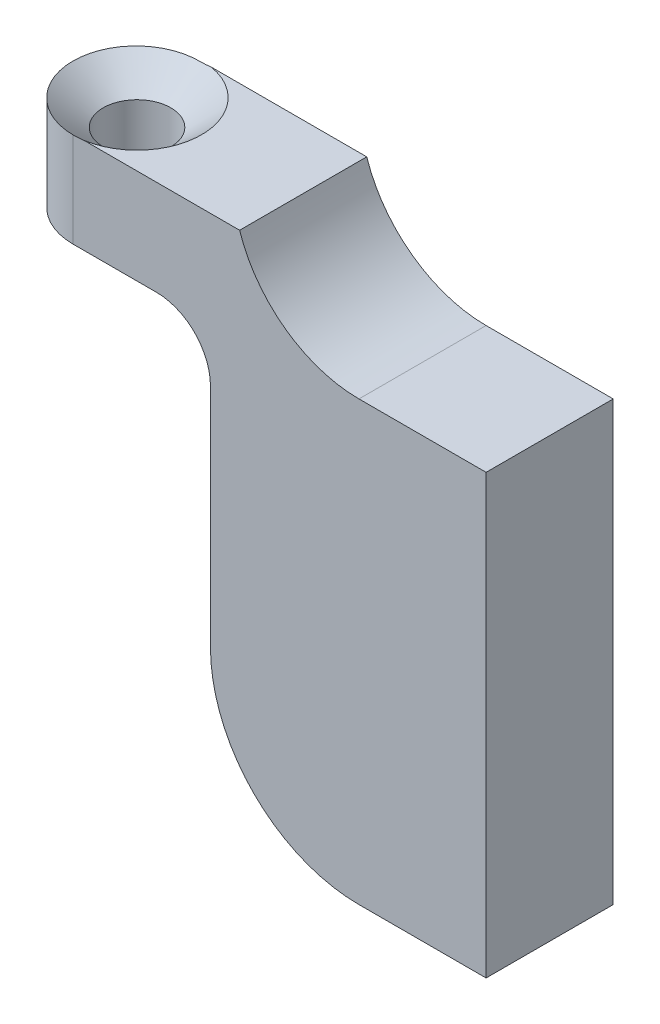
ISO-10303-21;
HEADER;
FILE_DESCRIPTION(('STEP AP214'),'2;1');
FILE_NAME('part.step','',(''),(''),'','','');
FILE_SCHEMA(('AUTOMOTIVE_DESIGN { 1 0 10303 214 1 1 1 1 }'));
ENDSEC;
DATA;
#1=APPLICATION_CONTEXT('core data for automotive mechanical design processes');
#2=APPLICATION_PROTOCOL_DEFINITION('international standard','automotive_design',2000,#1);
#3=PRODUCT_CONTEXT('',#1,'mechanical');
#4=PRODUCT('Part','Part','',(#3));
#5=PRODUCT_RELATED_PRODUCT_CATEGORY('part','',(#4));
#6=PRODUCT_DEFINITION_FORMATION('','',#4);
#7=PRODUCT_DEFINITION_CONTEXT('part definition',#1,'design');
#8=PRODUCT_DEFINITION('design','',#6,#7);
#9=PRODUCT_DEFINITION_SHAPE('','',#8);
#10=(LENGTH_UNIT() NAMED_UNIT(*) SI_UNIT(.MILLI.,.METRE.));
#11=(NAMED_UNIT(*) PLANE_ANGLE_UNIT() SI_UNIT($,.RADIAN.));
#12=(NAMED_UNIT(*) SI_UNIT($,.STERADIAN.) SOLID_ANGLE_UNIT());
#13=UNCERTAINTY_MEASURE_WITH_UNIT(LENGTH_MEASURE(1.E-05),#10,'distance_accuracy_value','');
#14=(GEOMETRIC_REPRESENTATION_CONTEXT(3) GLOBAL_UNCERTAINTY_ASSIGNED_CONTEXT((#13)) GLOBAL_UNIT_ASSIGNED_CONTEXT((#10,
#11,#12)) REPRESENTATION_CONTEXT('',''));
#15=CARTESIAN_POINT('',(0.,0.,0.));
#16=DIRECTION('',(0.,0.,1.));
#17=DIRECTION('',(1.,0.,0.));
#18=AXIS2_PLACEMENT_3D('',#15,#16,#17);
#19=CARTESIAN_POINT('',(-41.2749999999992,52.3130745451054,6.35));
#20=DIRECTION('',(0.,-1.,0.));
#21=DIRECTION('',(0.,0.,-1.));
#22=AXIS2_PLACEMENT_3D('',#19,#20,#21);
#23=CYLINDRICAL_SURFACE('',#22,6.35000000000026);
#24=DIRECTION('',(0.,-1.,0.));
#25=VECTOR('',#24,1.);
#26=CARTESIAN_POINT('',(-41.2749999999992,14.8404462835557,12.7));
#27=LINE('',#26,#25);
#28=CARTESIAN_POINT('',(-41.2749999999992,52.3130745451054,12.7));
#29=VERTEX_POINT('',#28);
#30=CARTESIAN_POINT('',(-41.275,42.8625,12.7));
#31=VERTEX_POINT('',#30);
#32=EDGE_CURVE('E211',#29,#31,#27,.T.);
#33=ORIENTED_EDGE('',*,*,#32,.F.);
#34=CARTESIAN_POINT('',(-41.2749999999992,52.3130745451054,0.));
#35=CARTESIAN_POINT('',(-41.4268698471331,52.3140939860725,-9.87468005514379E-06));
#36=CARTESIAN_POINT('',(-41.5787378013911,52.3151131175937,0.00544794530793456));
#37=CARTESIAN_POINT('',(-41.8816722784691,52.3171454239296,0.0272258373707776));
#38=CARTESIAN_POINT('',(-42.0327389077657,52.3181585995378,0.0435444279210268));
#39=CARTESIAN_POINT('',(-42.333390441845,52.320174443385,0.0869816690406525));
#40=CARTESIAN_POINT('',(-42.4829745640871,52.3211771060894,0.114105741388505));
#41=CARTESIAN_POINT('',(-42.7798244785303,52.3231663393665,0.179012242776178));
#42=CARTESIAN_POINT('',(-42.9270900087559,52.3241529081211,0.216795867232175));
#43=CARTESIAN_POINT('',(-43.2439947460277,52.326275355595,0.310347162208052));
#44=CARTESIAN_POINT('',(-43.413050975537,52.3274072280723,0.368103008695369));
#45=CARTESIAN_POINT('',(-43.7457620832815,52.3296341235968,0.497673645509659));
#46=CARTESIAN_POINT('',(-43.9094146417638,52.3307291308219,0.569494384393223));
#47=CARTESIAN_POINT('',(-44.2300621172719,52.3328739652706,0.726657600063899));
#48=CARTESIAN_POINT('',(-44.3870581156791,52.3339237998333,0.811997869804555));
#49=CARTESIAN_POINT('',(-44.6933057854976,52.3359711085018,0.995603527580531));
#50=CARTESIAN_POINT('',(-44.8425572739418,52.3369685813706,1.09386922079029));
#51=CARTESIAN_POINT('',(-45.1322293906621,52.3389039989278,1.30260987682396));
#52=CARTESIAN_POINT('',(-45.2726513503513,52.3398419525913,1.41308299191824));
#53=CARTESIAN_POINT('',(-45.5436911965323,52.3416519300888,1.6454658259427));
#54=CARTESIAN_POINT('',(-45.6743090412555,52.342523953642,1.76737559359139));
#55=CARTESIAN_POINT('',(-45.9248364787141,52.3441961355044,2.02179025019129));
#56=CARTESIAN_POINT('',(-46.0447439339612,52.3449962794686,2.15429724409001));
#57=CARTESIAN_POINT('',(-46.2729661951852,52.3465189009263,2.42893992624973));
#58=CARTESIAN_POINT('',(-46.3812812390111,52.3472413800132,2.57107541685887));
#59=CARTESIAN_POINT('',(-46.5855889348812,52.3486039014058,2.86402157045111));
#60=CARTESIAN_POINT('',(-46.68157703735,52.3492439132749,3.01483540683342));
#61=CARTESIAN_POINT('',(-46.8604686157668,52.3504365089439,3.32395933303365));
#62=CARTESIAN_POINT('',(-46.9433767584896,52.3509891239261,3.48226672291311));
#63=CARTESIAN_POINT('',(-47.0955353733745,52.3520031891373,3.80525713057763));
#64=CARTESIAN_POINT('',(-47.1647904930456,52.3524646703884,3.96993795592079));
#65=CARTESIAN_POINT('',(-47.2891729277185,52.3532934067367,4.30449373365843));
#66=CARTESIAN_POINT('',(-47.3443022274757,52.3536606750713,4.47436795259418));
#67=CARTESIAN_POINT('',(-47.4692968494963,52.3544933207101,4.92321976370062));
#68=CARTESIAN_POINT('',(-47.5276189126782,52.3548817598685,5.20550541387347));
#69=CARTESIAN_POINT('',(-47.6054643347005,52.355400210459,5.77518776350102));
#70=CARTESIAN_POINT('',(-47.6250018979635,52.3555303165028,6.06258255286371));
#71=CARTESIAN_POINT('',(-47.6249979781623,52.355530290788,6.65617612249392));
#72=CARTESIAN_POINT('',(-47.602822726082,52.3553826200574,6.96237795685506));
#73=CARTESIAN_POINT('',(-47.5144935535054,52.3547943416938,7.56862217616997));
#74=CARTESIAN_POINT('',(-47.4483160573978,52.3543535770262,7.86866117029854));
#75=CARTESIAN_POINT('',(-47.3099857952323,52.3534320608107,8.33327759555382));
#76=CARTESIAN_POINT('',(-47.2518390226122,52.3530446730122,8.50215631795867));
#77=CARTESIAN_POINT('',(-47.1215154805207,52.3521763087863,8.83446834735592));
#78=CARTESIAN_POINT('',(-47.0493372238806,52.3516953224386,8.99790107498561));
#79=CARTESIAN_POINT('',(-46.8914618054659,52.3506430933179,9.31812042399158));
#80=CARTESIAN_POINT('',(-46.8057626554945,52.3500718372712,9.47490606362998));
#81=CARTESIAN_POINT('',(-46.6214279124006,52.3488428665938,9.78075754511855));
#82=CARTESIAN_POINT('',(-46.5227877098191,52.3481851211564,9.92982060975895));
#83=CARTESIAN_POINT('',(-46.3133473067956,52.3467882563522,10.2190334246649));
#84=CARTESIAN_POINT('',(-46.2025529785512,52.3460491762812,10.3591874280458));
#85=CARTESIAN_POINT('',(-45.9695099205334,52.3444942512222,10.6297151271848));
#86=CARTESIAN_POINT('',(-45.8472569735738,52.343678377971,10.7600851900609));
#87=CARTESIAN_POINT('',(-45.5922631790315,52.3419762154945,11.0099992342401));
#88=CARTESIAN_POINT('',(-45.4595274723169,52.3410899607839,11.1295484612281));
#89=CARTESIAN_POINT('',(-45.1844095219935,52.3392525526835,11.3570844600893));
#90=CARTESIAN_POINT('',(-45.042023782562,52.3383013757741,11.4650670048636));
#91=CARTESIAN_POINT('',(-44.7486633474776,52.3363410897877,11.6686499687244));
#92=CARTESIAN_POINT('',(-44.5976888220746,52.3353319818591,11.7642506331257));
#93=CARTESIAN_POINT('',(-44.2882235271498,52.3332629116123,11.9423934831827));
#94=CARTESIAN_POINT('',(-44.1297326573017,52.3322029486152,12.0249354944707));
#95=CARTESIAN_POINT('',(-43.8063736180313,52.330039700871,12.1763626581602));
#96=CARTESIAN_POINT('',(-43.6415064168998,52.3289364227011,12.2452498744822));
#97=CARTESIAN_POINT('',(-43.3066083870603,52.3266945945607,12.3688840078618));
#98=CARTESIAN_POINT('',(-43.1365778845151,52.3255560468181,12.4236318160301));
#99=CARTESIAN_POINT('',(-42.6896669290981,52.3225624826503,12.5469611402987));
#100=CARTESIAN_POINT('',(-42.4095599532592,52.3206852723371,12.6043088722377));
#101=CARTESIAN_POINT('',(-41.9859149548997,52.3178445697991,12.661693093264));
#102=CARTESIAN_POINT('',(-41.8441436022331,52.3168936849093,12.6760482629347));
#103=CARTESIAN_POINT('',(-41.559933547615,52.3149869271481,12.6952007762607));
#104=CARTESIAN_POINT('',(-41.4174947412127,52.3140310534932,12.6999965702352));
#105=CARTESIAN_POINT('',(-41.2749999999993,52.3130745451056,12.7000000000003));
#106=B_SPLINE_CURVE_WITH_KNOTS('',3,(#34,#35,#36,#37,#38,#39,#40,#41,#42,#43,#44,#45,#46,#47,
#48,#49,#50,#51,#52,#53,#54,#55,#56,#57,#58,#59,#60,#61,#62,#63,#64,#65,#66,#67,#68,#69,#70,#71,
#72,#73,#74,#75,#76,#77,#78,#79,#80,#81,#82,#83,#84,#85,#86,#87,#88,#89,#90,#91,#92,#93,#94,#95,
#96,#97,#98,#99,#100,#101,#102,#103,#104,#105),.UNSPECIFIED.,.F.,.F.,(4,2,2,2,2,2,2,2,2,2,2,2,2,
2,2,2,2,2,2,2,2,2,2,2,2,2,2,2,2,2,2,2,2,2,2,4),(0.,0.455518696194547,0.910975267526965,
1.366660658012,1.82239717169296,2.35770541021033,2.8932405409974,3.42868833626617,
3.96414877594255,4.4995282784321,5.03491006166508,5.57039845420717,6.10587585767956,
6.64155032835359,7.17703324236563,7.71233356127577,8.24755862625456,9.10946066206404,
9.97104697687182,10.8888658486524,11.8071768679571,12.3424506069777,12.8777811095416,
13.4131904039441,13.9487909255887,14.4841338051537,15.0196744897535,15.5549541506595,
16.0904287693983,16.6258927774694,17.1613639347998,17.6967540939153,18.2321105027953,
19.0868657597344,19.5140981214998,19.9413997367462),.UNSPECIFIED.);
#107=CARTESIAN_POINT('',(-41.2749999999992,52.3130745451054,0.));
#108=VERTEX_POINT('',#107);
#109=EDGE_CURVE('E52',#108,#29,#106,.T.);
#110=ORIENTED_EDGE('',*,*,#109,.F.);
#111=DIRECTION('',(0.,1.,0.));
#112=VECTOR('',#111,1.);
#113=CARTESIAN_POINT('',(-41.2749999999992,52.3130745451054,0.));
#114=LINE('',#113,#112);
#115=CARTESIAN_POINT('',(-41.275,42.8625,0.));
#116=VERTEX_POINT('',#115);
#117=EDGE_CURVE('E260',#116,#108,#114,.T.);
#118=ORIENTED_EDGE('',*,*,#117,.F.);
#119=CARTESIAN_POINT('',(-41.2749999999992,42.8625,6.35));
#120=DIRECTION('',(0.,1.,0.));
#121=DIRECTION('',(0.,0.,1.));
#122=AXIS2_PLACEMENT_3D('',#119,#120,#121);
#123=CIRCLE('',#122,6.35000000000026);
#124=EDGE_CURVE('E11',#31,#116,#123,.F.);
#125=ORIENTED_EDGE('',*,*,#124,.F.);
#126=EDGE_LOOP('',(#33,#110,#118,#125));
#127=FACE_BOUND('',#126,.T.);
#128=ADVANCED_FACE('F43',(#127),#23,.T.);
#129=CARTESIAN_POINT('',(-24.6251819079608,52.3875,12.7));
#130=DIRECTION('',(0.,-1.,0.));
#131=DIRECTION('',(0.,0.,-1.));
#132=AXIS2_PLACEMENT_3D('',#129,#130,#131);
#133=PLANE('',#132);
#134=CARTESIAN_POINT('',(-41.2242,52.3875,6.35));
#135=DIRECTION('',(0.,1.,0.));
#136=DIRECTION('',(0.,0.,1.));
#137=AXIS2_PLACEMENT_3D('',#134,#135,#136);
#138=CIRCLE('',#137,6.4389);
#139=CARTESIAN_POINT('',(-40.1579292979735,52.3875,12.7));
#140=VERTEX_POINT('',#139);
#141=CARTESIAN_POINT('',(-40.1579292979735,52.3875,0.));
#142=VERTEX_POINT('',#141);
#143=EDGE_CURVE('E127',#140,#142,#138,.T.);
#144=ORIENTED_EDGE('',*,*,#143,.F.);
#145=DIRECTION('',(-1.,0.,0.));
#146=VECTOR('',#145,1.);
#147=CARTESIAN_POINT('',(-24.6251819079608,52.3875,12.7));
#148=LINE('',#147,#146);
#149=CARTESIAN_POINT('',(-24.6251819079608,52.3875,12.7));
#150=VERTEX_POINT('',#149);
#151=EDGE_CURVE('E140',#150,#140,#148,.T.);
#152=ORIENTED_EDGE('',*,*,#151,.F.);
#153=DIRECTION('',(0.,0.,-1.));
#154=VECTOR('',#153,1.);
#155=CARTESIAN_POINT('',(-24.6251819079608,52.3875,12.7));
#156=LINE('',#155,#154);
#157=CARTESIAN_POINT('',(-24.6251819079608,52.3875,0.));
#158=VERTEX_POINT('',#157);
#159=EDGE_CURVE('E192',#150,#158,#156,.T.);
#160=ORIENTED_EDGE('',*,*,#159,.T.);
#161=DIRECTION('',(-1.,0.,0.));
#162=VECTOR('',#161,1.);
#163=CARTESIAN_POINT('',(-24.6251819079608,52.3875,0.));
#164=LINE('',#163,#162);
#165=EDGE_CURVE('E142',#158,#142,#164,.T.);
#166=ORIENTED_EDGE('',*,*,#165,.T.);
#167=EDGE_LOOP('',(#144,#152,#160,#166));
#168=FACE_BOUND('',#167,.T.);
#169=ADVANCED_FACE('F138',(#168),#133,.F.);
#170=CARTESIAN_POINT('',(0.,0.,12.7));
#171=DIRECTION('',(0.,1.,0.));
#172=DIRECTION('',(-1.,0.,0.));
#173=AXIS2_PLACEMENT_3D('',#170,#171,#172);
#174=PLANE('',#173);
#175=DIRECTION('',(1.,0.,0.));
#176=VECTOR('',#175,1.);
#177=CARTESIAN_POINT('',(0.,0.,0.));
#178=LINE('',#177,#176);
#179=CARTESIAN_POINT('',(-12.7,0.,0.));
#180=VERTEX_POINT('',#179);
#181=CARTESIAN_POINT('',(0.,0.,0.));
#182=VERTEX_POINT('',#181);
#183=EDGE_CURVE('E162',#180,#182,#178,.T.);
#184=ORIENTED_EDGE('',*,*,#183,.T.);
#185=DIRECTION('',(0.,0.,-1.));
#186=VECTOR('',#185,1.);
#187=CARTESIAN_POINT('',(0.,0.,12.7));
#188=LINE('',#187,#186);
#189=CARTESIAN_POINT('',(0.,0.,12.7));
#190=VERTEX_POINT('',#189);
#191=EDGE_CURVE('E200',#190,#182,#188,.T.);
#192=ORIENTED_EDGE('',*,*,#191,.F.);
#193=DIRECTION('',(1.,0.,0.));
#194=VECTOR('',#193,1.);
#195=CARTESIAN_POINT('',(0.,0.,12.7));
#196=LINE('',#195,#194);
#197=CARTESIAN_POINT('',(-12.7,0.,12.7));
#198=VERTEX_POINT('',#197);
#199=EDGE_CURVE('E180',#198,#190,#196,.T.);
#200=ORIENTED_EDGE('',*,*,#199,.F.);
#201=DIRECTION('',(0.,0.,-1.));
#202=VECTOR('',#201,1.);
#203=CARTESIAN_POINT('',(-12.7,0.,12.7));
#204=LINE('',#203,#202);
#205=EDGE_CURVE('E161',#198,#180,#204,.T.);
#206=ORIENTED_EDGE('',*,*,#205,.T.);
#207=EDGE_LOOP('',(#184,#192,#200,#206));
#208=FACE_BOUND('',#207,.T.);
#209=ADVANCED_FACE('F242',(#208),#174,.F.);
#210=CARTESIAN_POINT('',(0.,0.,12.7));
#211=DIRECTION('',(-1.,0.,0.));
#212=DIRECTION('',(0.,0.,1.));
#213=AXIS2_PLACEMENT_3D('',#210,#211,#212);
#214=PLANE('',#213);
#215=DIRECTION('',(0.,1.,0.));
#216=VECTOR('',#215,1.);
#217=CARTESIAN_POINT('',(0.,0.,0.));
#218=LINE('',#217,#216);
#219=CARTESIAN_POINT('',(0.,43.7536003434413,0.));
#220=VERTEX_POINT('',#219);
#221=EDGE_CURVE('E165',#182,#220,#218,.T.);
#222=ORIENTED_EDGE('',*,*,#221,.T.);
#223=DIRECTION('',(0.,0.,-1.));
#224=VECTOR('',#223,1.);
#225=CARTESIAN_POINT('',(0.,43.7536003434413,12.7));
#226=LINE('',#225,#224);
#227=CARTESIAN_POINT('',(0.,43.7536003434413,12.7));
#228=VERTEX_POINT('',#227);
#229=EDGE_CURVE('E197',#228,#220,#226,.T.);
#230=ORIENTED_EDGE('',*,*,#229,.F.);
#231=DIRECTION('',(0.,1.,0.));
#232=VECTOR('',#231,1.);
#233=CARTESIAN_POINT('',(0.,0.,12.7));
#234=LINE('',#233,#232);
#235=EDGE_CURVE('E281',#190,#228,#234,.T.);
#236=ORIENTED_EDGE('',*,*,#235,.F.);
#237=ORIENTED_EDGE('',*,*,#191,.T.);
#238=EDGE_LOOP('',(#222,#230,#236,#237));
#239=FACE_BOUND('',#238,.T.);
#240=ADVANCED_FACE('F249',(#239),#214,.F.);
#241=CARTESIAN_POINT('',(0.,43.7536003434413,12.7));
#242=DIRECTION('',(0.,-1.,0.));
#243=DIRECTION('',(0.,0.,-1.));
#244=AXIS2_PLACEMENT_3D('',#241,#242,#243);
#245=PLANE('',#244);
#246=DIRECTION('',(-1.,0.,0.));
#247=VECTOR('',#246,1.);
#248=CARTESIAN_POINT('',(0.,43.7536003434413,0.));
#249=LINE('',#248,#247);
#250=CARTESIAN_POINT('',(-12.7,43.7536003434413,0.));
#251=VERTEX_POINT('',#250);
#252=EDGE_CURVE('E167',#220,#251,#249,.T.);
#253=ORIENTED_EDGE('',*,*,#252,.T.);
#254=DIRECTION('',(0.,0.,-1.));
#255=VECTOR('',#254,1.);
#256=CARTESIAN_POINT('',(-12.7,43.7536003434413,12.7));
#257=LINE('',#256,#255);
#258=CARTESIAN_POINT('',(-12.7,43.7536003434413,12.7));
#259=VERTEX_POINT('',#258);
#260=EDGE_CURVE('E194',#259,#251,#257,.T.);
#261=ORIENTED_EDGE('',*,*,#260,.F.);
#262=DIRECTION('',(-1.,0.,0.));
#263=VECTOR('',#262,1.);
#264=CARTESIAN_POINT('',(0.,43.7536003434413,12.7));
#265=LINE('',#264,#263);
#266=EDGE_CURVE('E152',#228,#259,#265,.T.);
#267=ORIENTED_EDGE('',*,*,#266,.F.);
#268=ORIENTED_EDGE('',*,*,#229,.T.);
#269=EDGE_LOOP('',(#253,#261,#267,#268));
#270=FACE_BOUND('',#269,.T.);
#271=ADVANCED_FACE('F245',(#270),#245,.F.);
#272=CARTESIAN_POINT('',(-12.7,56.3061082158732,12.7));
#273=DIRECTION('',(0.,0.,-1.));
#274=DIRECTION('',(-1.,0.,0.));
#275=AXIS2_PLACEMENT_3D('',#272,#273,#274);
#276=CYLINDRICAL_SURFACE('',#275,12.5525078724319);
#277=CARTESIAN_POINT('',(-12.7,56.3061082158732,0.));
#278=DIRECTION('',(0.,0.,-1.));
#279=DIRECTION('',(-1.,0.,0.));
#280=AXIS2_PLACEMENT_3D('',#277,#278,#279);
#281=CIRCLE('',#280,12.5525078724319);
#282=EDGE_CURVE('E169',#251,#158,#281,.T.);
#283=ORIENTED_EDGE('',*,*,#282,.T.);
#284=ORIENTED_EDGE('',*,*,#159,.F.);
#285=CARTESIAN_POINT('',(-12.7,56.3061082158732,12.7));
#286=DIRECTION('',(0.,0.,-1.));
#287=DIRECTION('',(-1.,0.,0.));
#288=AXIS2_PLACEMENT_3D('',#285,#286,#287);
#289=CIRCLE('',#288,12.5525078724319);
#290=EDGE_CURVE('E146',#259,#150,#289,.T.);
#291=ORIENTED_EDGE('',*,*,#290,.F.);
#292=ORIENTED_EDGE('',*,*,#260,.T.);
#293=EDGE_LOOP('',(#283,#284,#291,#292));
#294=FACE_BOUND('',#293,.T.);
#295=ADVANCED_FACE('F238',(#294),#276,.F.);
#296=CARTESIAN_POINT('',(-47.625,42.8625,12.7));
#297=DIRECTION('',(0.,1.,0.));
#298=DIRECTION('',(0.,0.,1.));
#299=AXIS2_PLACEMENT_3D('',#296,#297,#298);
#300=PLANE('',#299);
#301=CARTESIAN_POINT('',(-41.2242,42.8625,6.35));
#302=DIRECTION('',(0.,1.,0.));
#303=DIRECTION('',(0.,0.,1.));
#304=AXIS2_PLACEMENT_3D('',#301,#302,#303);
#305=CIRCLE('',#304,3.37819999999999);
#306=CARTESIAN_POINT('',(-41.2242,42.8625,9.72819999999999));
#307=VERTEX_POINT('',#306);
#308=EDGE_CURVE('E132',#307,#307,#305,.T.);
#309=ORIENTED_EDGE('',*,*,#308,.T.);
#310=EDGE_LOOP('',(#309));
#311=FACE_BOUND('',#310,.T.);
#312=DIRECTION('',(1.,0.,0.));
#313=VECTOR('',#312,1.);
#314=CARTESIAN_POINT('',(-47.625,42.8625,12.7));
#315=LINE('',#314,#313);
#316=CARTESIAN_POINT('',(-32.9358206867217,42.8625,12.7));
#317=VERTEX_POINT('',#316);
#318=EDGE_CURVE('E148',#31,#317,#315,.T.);
#319=ORIENTED_EDGE('',*,*,#318,.F.);
#320=ORIENTED_EDGE('',*,*,#124,.T.);
#321=DIRECTION('',(1.,0.,0.));
#322=VECTOR('',#321,1.);
#323=CARTESIAN_POINT('',(-47.625,42.8625,0.));
#324=LINE('',#323,#322);
#325=CARTESIAN_POINT('',(-32.9358206867217,42.8625,0.));
#326=VERTEX_POINT('',#325);
#327=EDGE_CURVE('E172',#116,#326,#324,.T.);
#328=ORIENTED_EDGE('',*,*,#327,.T.);
#329=DIRECTION('',(0.,0.,-1.));
#330=VECTOR('',#329,1.);
#331=CARTESIAN_POINT('',(-32.9358206867217,42.8625,12.7));
#332=LINE('',#331,#330);
#333=EDGE_CURVE('E189',#317,#326,#332,.T.);
#334=ORIENTED_EDGE('',*,*,#333,.F.);
#335=EDGE_LOOP('',(#319,#320,#328,#334));
#336=FACE_BOUND('',#335,.T.);
#337=ADVANCED_FACE('F234',(#311,#336),#300,.F.);
#338=CARTESIAN_POINT('',(-32.9358206867217,37.467125596834,12.7));
#339=DIRECTION('',(0.,0.,-1.));
#340=DIRECTION('',(-1.,0.,0.));
#341=AXIS2_PLACEMENT_3D('',#338,#339,#340);
#342=CYLINDRICAL_SURFACE('',#341,5.39537440316596);
#343=CARTESIAN_POINT('',(-32.9358206867217,37.467125596834,0.));
#344=DIRECTION('',(0.,0.,-1.));
#345=DIRECTION('',(1.,0.,0.));
#346=AXIS2_PLACEMENT_3D('',#343,#344,#345);
#347=CIRCLE('',#346,5.39537440316596);
#348=CARTESIAN_POINT('',(-27.5404462835557,37.467125596834,0.));
#349=VERTEX_POINT('',#348);
#350=EDGE_CURVE('E174',#326,#349,#347,.T.);
#351=ORIENTED_EDGE('',*,*,#350,.T.);
#352=DIRECTION('',(0.,0.,-1.));
#353=VECTOR('',#352,1.);
#354=CARTESIAN_POINT('',(-27.5404462835557,37.467125596834,12.7));
#355=LINE('',#354,#353);
#356=CARTESIAN_POINT('',(-27.5404462835557,37.467125596834,12.7));
#357=VERTEX_POINT('',#356);
#358=EDGE_CURVE('E186',#357,#349,#355,.T.);
#359=ORIENTED_EDGE('',*,*,#358,.F.);
#360=CARTESIAN_POINT('',(-32.9358206867217,37.467125596834,12.7));
#361=DIRECTION('',(0.,0.,-1.));
#362=DIRECTION('',(1.,0.,0.));
#363=AXIS2_PLACEMENT_3D('',#360,#361,#362);
#364=CIRCLE('',#363,5.39537440316596);
#365=EDGE_CURVE('E150',#317,#357,#364,.T.);
#366=ORIENTED_EDGE('',*,*,#365,.F.);
#367=ORIENTED_EDGE('',*,*,#333,.T.);
#368=EDGE_LOOP('',(#351,#359,#366,#367));
#369=FACE_BOUND('',#368,.T.);
#370=ADVANCED_FACE('F230',(#369),#342,.F.);
#371=CARTESIAN_POINT('',(-27.5404462835557,14.8404462835557,12.7));
#372=DIRECTION('',(1.,0.,0.));
#373=DIRECTION('',(0.,1.,0.));
#374=AXIS2_PLACEMENT_3D('',#371,#372,#373);
#375=PLANE('',#374);
#376=DIRECTION('',(0.,-1.,0.));
#377=VECTOR('',#376,1.);
#378=CARTESIAN_POINT('',(-27.5404462835557,14.8404462835557,0.));
#379=LINE('',#378,#377);
#380=CARTESIAN_POINT('',(-27.5404462835557,14.8404462835557,0.));
#381=VERTEX_POINT('',#380);
#382=EDGE_CURVE('E176',#349,#381,#379,.T.);
#383=ORIENTED_EDGE('',*,*,#382,.T.);
#384=DIRECTION('',(0.,0.,-1.));
#385=VECTOR('',#384,1.);
#386=CARTESIAN_POINT('',(-27.5404462835557,14.8404462835557,12.7));
#387=LINE('',#386,#385);
#388=CARTESIAN_POINT('',(-27.5404462835557,14.8404462835557,12.7));
#389=VERTEX_POINT('',#388);
#390=EDGE_CURVE('E183',#389,#381,#387,.T.);
#391=ORIENTED_EDGE('',*,*,#390,.F.);
#392=DIRECTION('',(0.,-1.,0.));
#393=VECTOR('',#392,1.);
#394=CARTESIAN_POINT('',(-27.5404462835557,14.8404462835557,12.7));
#395=LINE('',#394,#393);
#396=EDGE_CURVE('E157',#357,#389,#395,.T.);
#397=ORIENTED_EDGE('',*,*,#396,.F.);
#398=ORIENTED_EDGE('',*,*,#358,.T.);
#399=EDGE_LOOP('',(#383,#391,#397,#398));
#400=FACE_BOUND('',#399,.T.);
#401=ADVANCED_FACE('F226',(#400),#375,.F.);
#402=CARTESIAN_POINT('',(-12.7,14.8404462835557,12.7));
#403=DIRECTION('',(0.,0.,-1.));
#404=DIRECTION('',(-1.,0.,0.));
#405=AXIS2_PLACEMENT_3D('',#402,#403,#404);
#406=CYLINDRICAL_SURFACE('',#405,14.8404462835557);
#407=CARTESIAN_POINT('',(-12.7,14.8404462835557,0.));
#408=DIRECTION('',(0.,0.,1.));
#409=DIRECTION('',(-1.,0.,0.));
#410=AXIS2_PLACEMENT_3D('',#407,#408,#409);
#411=CIRCLE('',#410,14.8404462835557);
#412=EDGE_CURVE('E178',#381,#180,#411,.T.);
#413=ORIENTED_EDGE('',*,*,#412,.T.);
#414=ORIENTED_EDGE('',*,*,#205,.F.);
#415=CARTESIAN_POINT('',(-12.7,14.8404462835557,12.7));
#416=DIRECTION('',(0.,0.,1.));
#417=DIRECTION('',(-1.,0.,0.));
#418=AXIS2_PLACEMENT_3D('',#415,#416,#417);
#419=CIRCLE('',#418,14.8404462835557);
#420=EDGE_CURVE('E159',#389,#198,#419,.T.);
#421=ORIENTED_EDGE('',*,*,#420,.F.);
#422=ORIENTED_EDGE('',*,*,#390,.T.);
#423=EDGE_LOOP('',(#413,#414,#421,#422));
#424=FACE_BOUND('',#423,.T.);
#425=ADVANCED_FACE('F223',(#424),#406,.T.);
#426=CARTESIAN_POINT('',(-12.7,14.8404462835557,12.7));
#427=DIRECTION('',(0.,0.,-1.));
#428=DIRECTION('',(-1.,0.,0.));
#429=AXIS2_PLACEMENT_3D('',#426,#427,#428);
#430=PLANE('',#429);
#431=CARTESIAN_POINT('',(-53.3381473295414,58.4612904455303,12.7));
#432=CARTESIAN_POINT('',(-53.0735110252883,58.2646411833426,12.7));
#433=CARTESIAN_POINT('',(-52.8082288349141,58.0688539925313,12.7));
#434=CARTESIAN_POINT('',(-52.2760753388768,57.6794158229601,12.7));
#435=CARTESIAN_POINT('',(-52.0092039306882,57.4857649843731,12.7));
#436=CARTESIAN_POINT('',(-51.4729833802749,57.1005878829224,12.7));
#437=CARTESIAN_POINT('',(-51.2036299056588,56.9090676415087,12.7));
#438=CARTESIAN_POINT('',(-50.6626989941641,56.5292027122639,12.7));
#439=CARTESIAN_POINT('',(-50.3911216089012,56.3408579510401,12.7));
#440=CARTESIAN_POINT('',(-49.8324363339014,55.9593259007964,12.7));
#441=CARTESIAN_POINT('',(-49.5451989554731,55.7663277486669,12.7));
#442=CARTESIAN_POINT('',(-48.9671192145794,55.3858125278514,12.7));
#443=CARTESIAN_POINT('',(-48.6762769785875,55.1982952676437,12.7));
#444=CARTESIAN_POINT('',(-48.0903923723612,54.8305085807861,12.7));
#445=CARTESIAN_POINT('',(-47.7953540368313,54.6502327551875,12.7));
#446=CARTESIAN_POINT('',(-47.1997956167185,54.2990166886458,12.7));
#447=CARTESIAN_POINT('',(-46.8992763453883,54.1280750775001,12.7));
#448=CARTESIAN_POINT('',(-46.2913635858222,53.7986440822461,12.7));
#449=CARTESIAN_POINT('',(-45.9839689275547,53.6401568386159,12.7));
#450=CARTESIAN_POINT('',(-45.3607222136627,53.3401096165242,12.7));
#451=CARTESIAN_POINT('',(-45.0448660830365,53.1985579802828,12.7));
#452=CARTESIAN_POINT('',(-44.4072173111987,52.9402787217476,12.7));
#453=CARTESIAN_POINT('',(-44.0855338422315,52.8232857671269,12.7));
#454=CARTESIAN_POINT('',(-43.4326772847263,52.6202566057938,12.7));
#455=CARTESIAN_POINT('',(-43.1015188895572,52.5341750032105,12.7));
#456=CARTESIAN_POINT('',(-42.6201818974961,52.4388313518332,12.7));
#457=CARTESIAN_POINT('',(-42.4731030858524,52.4136076582338,12.7));
#458=CARTESIAN_POINT('',(-42.1776247528489,52.3712435828372,12.7));
#459=CARTESIAN_POINT('',(-42.0292240536617,52.3541113428451,12.7));
#460=CARTESIAN_POINT('',(-41.6643048650118,52.3226449687396,12.7));
#461=CARTESIAN_POINT('',(-41.4473525970424,52.3130858926582,12.7));
#462=CARTESIAN_POINT('',(-41.0133744053442,52.3127272121064,12.7));
#463=CARTESIAN_POINT('',(-40.7963484816149,52.3219339774769,12.7));
#464=CARTESIAN_POINT('',(-40.363523546553,52.3585825211394,12.7));
#465=CARTESIAN_POINT('',(-40.1477269405773,52.3860523711677,12.7));
#466=CARTESIAN_POINT('',(-39.7189752669248,52.4577132491807,12.7));
#467=CARTESIAN_POINT('',(-39.5060204321282,52.5019056389535,12.7));
#468=CARTESIAN_POINT('',(-38.9480345645735,52.6380173931819,12.7));
#469=CARTESIAN_POINT('',(-38.606014338681,52.742360958386,12.7));
#470=CARTESIAN_POINT('',(-38.1010581477317,52.9211044224072,12.7));
#471=CARTESIAN_POINT('',(-37.9339906877679,52.9844333951099,12.7));
#472=CARTESIAN_POINT('',(-37.6024003577027,53.1174434107413,12.7));
#473=CARTESIAN_POINT('',(-37.4378772669664,53.1871238992451,12.7));
#474=CARTESIAN_POINT('',(-37.109239193348,53.3327685023097,12.7));
#475=CARTESIAN_POINT('',(-36.945153954791,53.4087991928236,12.7));
#476=CARTESIAN_POINT('',(-36.6192440545763,53.5655537561667,12.7));
#477=CARTESIAN_POINT('',(-36.4574194234235,53.6462776922514,12.7));
#478=CARTESIAN_POINT('',(-36.13590118449,53.8116734258349,12.7));
#479=CARTESIAN_POINT('',(-35.9762066314615,53.8963433918209,12.7));
#480=CARTESIAN_POINT('',(-35.6586767699603,54.0690747166275,12.7));
#481=CARTESIAN_POINT('',(-35.5008413763673,54.1571359193886,12.7));
#482=CARTESIAN_POINT('',(-35.1466599793174,54.3590631944482,12.7));
#483=CARTESIAN_POINT('',(-34.950792201003,54.4737673061458,12.7));
#484=CARTESIAN_POINT('',(-34.5613270324975,54.7069738894368,12.7));
#485=CARTESIAN_POINT('',(-34.3677297494817,54.8254765393567,12.7));
#486=CARTESIAN_POINT('',(-33.7898171850468,55.1857530321962,12.7));
#487=CARTESIAN_POINT('',(-33.408449667241,55.4322557770743,12.7));
#488=CARTESIAN_POINT('',(-32.6513932084703,55.9343940915029,12.7));
#489=CARTESIAN_POINT('',(-32.2757089583724,56.1900366758779,12.7));
#490=CARTESIAN_POINT('',(-31.5289644738444,56.7078978319327,12.7));
#491=CARTESIAN_POINT('',(-31.1579038045852,56.9701157781316,12.7));
#492=CARTESIAN_POINT('',(-30.4182140069063,57.5003447165634,12.7));
#493=CARTESIAN_POINT('',(-30.0495959666605,57.7683711336721,12.7));
#494=CARTESIAN_POINT('',(-29.3151945791072,58.3082891039316,12.7));
#495=CARTESIAN_POINT('',(-28.9494112899291,58.58018073602,12.7));
#496=CARTESIAN_POINT('',(-28.2202866818927,59.1268743570854,12.7));
#497=CARTESIAN_POINT('',(-27.856944336439,59.4016749786849,12.7));
#498=CARTESIAN_POINT('',(-27.1321084242816,59.9537051563668,12.7));
#499=CARTESIAN_POINT('',(-26.7706148674549,60.2309347254042,12.7));
#500=CARTESIAN_POINT('',(-25.7720027317284,61.0010883895166,12.7));
#501=CARTESIAN_POINT('',(-25.1364918584884,61.4960965142768,12.7));
#502=CARTESIAN_POINT('',(-23.8688100119883,62.4905304320902,12.7));
#503=CARTESIAN_POINT('',(-23.2366394839854,62.9899567914785,12.7));
#504=CARTESIAN_POINT('',(-21.9785431893864,63.9891121544672,12.7));
#505=CARTESIAN_POINT('',(-21.3526025080093,64.4888223894128,12.7));
#506=CARTESIAN_POINT('',(-20.4151985665447,65.2401696267555,12.7));
#507=CARTESIAN_POINT('',(-20.1030051509908,65.4908967936787,12.7));
#508=CARTESIAN_POINT('',(-19.479051463419,65.9928885920127,12.7));
#509=CARTESIAN_POINT('',(-19.167291190755,66.2441532226204,12.7));
#510=CARTESIAN_POINT('',(-18.8557203075424,66.4956525347533,12.7));
#511=B_SPLINE_CURVE_WITH_KNOTS('',3,(#431,#432,#433,#434,#435,#436,#437,#438,#439,#440,#441,
#442,#443,#444,#445,#446,#447,#448,#449,#450,#451,#452,#453,#454,#455,#456,#457,#458,#459,#460,
#461,#462,#463,#464,#465,#466,#467,#468,#469,#470,#471,#472,#473,#474,#475,#476,#477,#478,#479,
#480,#481,#482,#483,#484,#485,#486,#487,#488,#489,#490,#491,#492,#493,#494,#495,#496,#497,#498,
#499,#500,#501,#502,#503,#504,#505,#506,#507,#508,#509,#510),.UNSPECIFIED.,.F.,.F.,(4,2,2,2,2,2,
2,2,2,2,2,2,2,2,2,2,2,2,2,2,2,2,2,2,2,2,2,2,2,2,2,2,2,2,2,2,2,2,2,4),(0.,0.989110095114678,
1.97828470746881,2.96977058963847,3.96123352481008,4.9993477585809,6.03742567349491,
7.0745651435381,8.11155195662957,9.14871660413788,10.1863900577765,11.2121987292735,
12.2364946948709,12.6839814708825,13.1319175640047,13.7825687689113,14.4334408663829,
15.0853157234093,15.7372436768277,16.8078541849956,17.3437806115803,17.8796603017637,
18.4221113065393,18.9645696241505,19.506778624651,20.0489627032638,20.7298566548005,
21.410782618577,22.7728717913521,24.136029808308,25.4990586432192,26.8663084030602,
28.2335861259019,29.6002474216431,30.9669160110134,33.3835288044776,35.8004559851759,
38.2032809302607,39.4045130245876,40.6057433252872),.UNSPECIFIED.);
#512=EDGE_CURVE('E123',#140,#29,#511,.F.);
#513=ORIENTED_EDGE('',*,*,#512,.T.);
#514=ORIENTED_EDGE('',*,*,#32,.T.);
#515=ORIENTED_EDGE('',*,*,#318,.T.);
#516=ORIENTED_EDGE('',*,*,#365,.T.);
#517=ORIENTED_EDGE('',*,*,#396,.T.);
#518=ORIENTED_EDGE('',*,*,#420,.T.);
#519=ORIENTED_EDGE('',*,*,#199,.T.);
#520=ORIENTED_EDGE('',*,*,#235,.T.);
#521=ORIENTED_EDGE('',*,*,#266,.T.);
#522=ORIENTED_EDGE('',*,*,#290,.T.);
#523=ORIENTED_EDGE('',*,*,#151,.T.);
#524=EDGE_LOOP('',(#513,#514,#515,#516,#517,#518,#519,#520,#521,#522,#523));
#525=FACE_BOUND('',#524,.T.);
#526=ADVANCED_FACE('F144',(#525),#430,.F.);
#527=CARTESIAN_POINT('',(-12.7,14.8404462835557,0.));
#528=DIRECTION('',(0.,0.,-1.));
#529=DIRECTION('',(-1.,0.,0.));
#530=AXIS2_PLACEMENT_3D('',#527,#528,#529);
#531=PLANE('',#530);
#532=ORIENTED_EDGE('',*,*,#327,.F.);
#533=ORIENTED_EDGE('',*,*,#117,.T.);
#534=CARTESIAN_POINT('',(-53.3381473295778,58.4612904455574,0.));
#535=CARTESIAN_POINT('',(-53.0735110253235,58.2646411833686,0.));
#536=CARTESIAN_POINT('',(-52.808228834948,58.0688539925562,0.));
#537=CARTESIAN_POINT('',(-52.2760753389082,57.679415822983,0.));
#538=CARTESIAN_POINT('',(-52.0092039307183,57.4857649843949,0.));
#539=CARTESIAN_POINT('',(-51.4729833803024,57.100587882942,0.));
#540=CARTESIAN_POINT('',(-51.203629905685,56.9090676415273,0.));
#541=CARTESIAN_POINT('',(-50.6626989941878,56.5292027122804,0.));
#542=CARTESIAN_POINT('',(-50.3911216089237,56.3408579510555,0.));
#543=CARTESIAN_POINT('',(-49.832436333921,55.9593259008097,0.));
#544=CARTESIAN_POINT('',(-49.5451989554913,55.766327748679,0.));
#545=CARTESIAN_POINT('',(-48.9671192145947,55.3858125278613,0.));
#546=CARTESIAN_POINT('',(-48.6762769786012,55.1982952676525,0.));
#547=CARTESIAN_POINT('',(-48.0903923723719,54.8305085807927,0.));
#548=CARTESIAN_POINT('',(-47.7953540368405,54.650232755193,0.));
#549=CARTESIAN_POINT('',(-47.1997956167246,54.2990166886492,0.));
#550=CARTESIAN_POINT('',(-46.8992763453928,54.1280750775026,0.));
#551=CARTESIAN_POINT('',(-46.2913635858246,53.7986440822473,0.));
#552=CARTESIAN_POINT('',(-45.9839689275567,53.6401568386169,0.));
#553=CARTESIAN_POINT('',(-45.3607222136637,53.3401096165247,0.));
#554=CARTESIAN_POINT('',(-45.044866083037,53.198557980283,0.));
#555=CARTESIAN_POINT('',(-44.4072173111982,52.9402787217474,0.));
#556=CARTESIAN_POINT('',(-44.0855338422304,52.8232857671265,0.));
#557=CARTESIAN_POINT('',(-43.4326772847242,52.6202566057932,0.));
#558=CARTESIAN_POINT('',(-43.1015188895547,52.5341750032098,0.));
#559=CARTESIAN_POINT('',(-42.6201818974939,52.4388313518328,0.));
#560=CARTESIAN_POINT('',(-42.4731030858512,52.4136076582336,0.));
#561=CARTESIAN_POINT('',(-42.1776247528496,52.3712435828373,0.));
#562=CARTESIAN_POINT('',(-42.0292240536634,52.3541113428453,0.));
#563=CARTESIAN_POINT('',(-41.6643048650147,52.3226449687398,0.));
#564=CARTESIAN_POINT('',(-41.4473525970453,52.3130858926583,0.));
#565=CARTESIAN_POINT('',(-41.0133744053473,52.3127272121063,0.));
#566=CARTESIAN_POINT('',(-40.7963484816182,52.3219339774767,0.));
#567=CARTESIAN_POINT('',(-40.3635235465565,52.358582521139,0.));
#568=CARTESIAN_POINT('',(-40.1477269405809,52.3860523711672,0.));
#569=CARTESIAN_POINT('',(-39.7189752669286,52.45771324918,0.));
#570=CARTESIAN_POINT('',(-39.5060204321321,52.5019056389526,0.));
#571=CARTESIAN_POINT('',(-38.9480345645779,52.6380173931807,0.));
#572=CARTESIAN_POINT('',(-38.6060143386859,52.7423609583844,0.));
#573=CARTESIAN_POINT('',(-38.1010581477374,52.9211044224051,0.));
#574=CARTESIAN_POINT('',(-37.9339906877738,52.9844333951076,0.));
#575=CARTESIAN_POINT('',(-37.6024003577089,53.1174434107387,0.));
#576=CARTESIAN_POINT('',(-37.4378772669729,53.1871238992423,0.));
#577=CARTESIAN_POINT('',(-37.1092391933549,53.3327685023065,0.));
#578=CARTESIAN_POINT('',(-36.9451539547981,53.4087991928202,0.));
#579=CARTESIAN_POINT('',(-36.6192440545839,53.565553756163,0.));
#580=CARTESIAN_POINT('',(-36.4574194234313,53.6462776922475,0.));
#581=CARTESIAN_POINT('',(-36.1359011844982,53.8116734258306,0.));
#582=CARTESIAN_POINT('',(-35.9762066314699,53.8963433918164,0.));
#583=CARTESIAN_POINT('',(-35.6586767699691,54.0690747166226,0.));
#584=CARTESIAN_POINT('',(-35.5008413763764,54.1571359193835,0.));
#585=CARTESIAN_POINT('',(-35.146659979327,54.3590631944427,0.));
#586=CARTESIAN_POINT('',(-34.9507922010128,54.47376730614,0.));
#587=CARTESIAN_POINT('',(-34.5613270325079,54.7069738894304,0.));
#588=CARTESIAN_POINT('',(-34.3677297494925,54.82547653935,0.));
#589=CARTESIAN_POINT('',(-33.7898171850585,55.1857530321888,0.));
#590=CARTESIAN_POINT('',(-33.4084496672532,55.4322557770664,0.));
#591=CARTESIAN_POINT('',(-32.6513932084837,55.9343940914938,0.));
#592=CARTESIAN_POINT('',(-32.2757089583864,56.1900366758684,0.));
#593=CARTESIAN_POINT('',(-31.5289644738595,56.707897831922,0.));
#594=CARTESIAN_POINT('',(-31.157903804601,56.9701157781204,0.));
#595=CARTESIAN_POINT('',(-30.4182140069232,57.5003447165511,0.));
#596=CARTESIAN_POINT('',(-30.049595966678,57.7683711336594,0.));
#597=CARTESIAN_POINT('',(-29.3151945791259,58.3082891039178,0.));
#598=CARTESIAN_POINT('',(-28.9494112899483,58.5801807360057,0.));
#599=CARTESIAN_POINT('',(-28.2202866819132,59.12687435707,0.));
#600=CARTESIAN_POINT('',(-27.85694433646,59.401674978669,0.));
#601=CARTESIAN_POINT('',(-27.1321084243038,59.9537051563498,0.));
#602=CARTESIAN_POINT('',(-26.7706148674777,60.2309347253867,0.));
#603=CARTESIAN_POINT('',(-25.7720027317529,61.0010883894977,0.));
#604=CARTESIAN_POINT('',(-25.1364918585139,61.4960965142569,0.));
#605=CARTESIAN_POINT('',(-23.8688100120159,62.4905304320684,0.));
#606=CARTESIAN_POINT('',(-23.2366394840141,62.9899567914558,0.));
#607=CARTESIAN_POINT('',(-21.9785431894172,63.9891121544427,0.));
#608=CARTESIAN_POINT('',(-21.3526025080411,64.4888223893874,0.));
#609=CARTESIAN_POINT('',(-20.415198566578,65.2401696267287,0.));
#610=CARTESIAN_POINT('',(-20.1030051510247,65.4908967936514,0.));
#611=CARTESIAN_POINT('',(-19.479051463454,65.9928885919845,0.));
#612=CARTESIAN_POINT('',(-19.1672911907905,66.2441532225918,0.));
#613=CARTESIAN_POINT('',(-18.8557203075785,66.4956525347242,0.));
#614=B_SPLINE_CURVE_WITH_KNOTS('',3,(#534,#535,#536,#537,#538,#539,#540,#541,#542,#543,#544,
#545,#546,#547,#548,#549,#550,#551,#552,#553,#554,#555,#556,#557,#558,#559,#560,#561,#562,#563,
#564,#565,#566,#567,#568,#569,#570,#571,#572,#573,#574,#575,#576,#577,#578,#579,#580,#581,#582,
#583,#584,#585,#586,#587,#588,#589,#590,#591,#592,#593,#594,#595,#596,#597,#598,#599,#600,#601,
#602,#603,#604,#605,#606,#607,#608,#609,#610,#611,#612,#613),.UNSPECIFIED.,.F.,.F.,(4,2,2,2,2,2,
2,2,2,2,2,2,2,2,2,2,2,2,2,2,2,2,2,2,2,2,2,2,2,2,2,2,2,2,2,2,2,2,2,4),(0.,0.989110095119617,
1.9782847074787,2.96977058965331,3.96123352482989,4.99934775860628,6.03742567352588,
7.07456514357464,8.11155195667165,9.14871660418163,10.1863900578219,11.2121987293205,
12.2364946949194,12.6839814709281,13.1319175640473,13.7825687689536,14.4334408664249,
15.0853157234509,15.737243676869,16.8078541850353,17.3437806116191,17.8796603018017,
18.4221113065766,18.9645696241868,19.5067786246866,20.0489627032985,20.729856654834,
21.4107826186093,22.7728717913821,24.1360298083356,25.4990586432444,26.8663084030831,
28.2335861259224,29.6002474216613,30.9669160110292,33.3835288044893,35.8004559851833,
38.203280930264,39.4045130245888,40.6057433252863),.UNSPECIFIED.);
#615=EDGE_CURVE('E203',#142,#108,#614,.F.);
#616=ORIENTED_EDGE('',*,*,#615,.F.);
#617=ORIENTED_EDGE('',*,*,#165,.F.);
#618=ORIENTED_EDGE('',*,*,#282,.F.);
#619=ORIENTED_EDGE('',*,*,#252,.F.);
#620=ORIENTED_EDGE('',*,*,#221,.F.);
#621=ORIENTED_EDGE('',*,*,#183,.F.);
#622=ORIENTED_EDGE('',*,*,#412,.F.);
#623=ORIENTED_EDGE('',*,*,#382,.F.);
#624=ORIENTED_EDGE('',*,*,#350,.F.);
#625=EDGE_LOOP('',(#532,#533,#616,#617,#618,#619,#620,#621,#622,#623,#624));
#626=FACE_BOUND('',#625,.T.);
#627=ADVANCED_FACE('F215',(#626),#531,.T.);
#628=CARTESIAN_POINT('',(-41.2242,52.3875,6.35));
#629=DIRECTION('',(0.,1.,0.));
#630=DIRECTION('',(0.,0.,1.));
#631=AXIS2_PLACEMENT_3D('',#628,#629,#630);
#632=CYLINDRICAL_SURFACE('',#631,3.37819999999999);
#633=CARTESIAN_POINT('',(-41.2242,49.8192677588557,6.35));
#634=DIRECTION('',(0.,1.,0.));
#635=DIRECTION('',(0.,0.,1.));
#636=AXIS2_PLACEMENT_3D('',#633,#634,#635);
#637=CIRCLE('',#636,3.37819999999999);
#638=CARTESIAN_POINT('',(-41.2242,49.8192677588557,9.72819999999999));
#639=VERTEX_POINT('',#638);
#640=EDGE_CURVE('E133',#639,#639,#637,.T.);
#641=ORIENTED_EDGE('',*,*,#640,.T.);
#642=EDGE_LOOP('',(#641));
#643=FACE_BOUND('',#642,.T.);
#644=ORIENTED_EDGE('',*,*,#308,.F.);
#645=EDGE_LOOP('',(#644));
#646=FACE_BOUND('',#645,.T.);
#647=ADVANCED_FACE('F220',(#643,#646),#632,.F.);
#648=CARTESIAN_POINT('',(-41.2242,52.3875,6.35));
#649=DIRECTION('',(0.,1.,0.));
#650=DIRECTION('',(0.,0.,1.));
#651=AXIS2_PLACEMENT_3D('',#648,#649,#650);
#652=CONICAL_SURFACE('',#651,6.4389,0.872664625997167);
#653=ORIENTED_EDGE('',*,*,#640,.F.);
#654=EDGE_LOOP('',(#653));
#655=FACE_BOUND('',#654,.T.);
#656=ORIENTED_EDGE('',*,*,#615,.T.);
#657=ORIENTED_EDGE('',*,*,#109,.T.);
#658=ORIENTED_EDGE('',*,*,#512,.F.);
#659=ORIENTED_EDGE('',*,*,#143,.T.);
#660=EDGE_LOOP('',(#656,#657,#658,#659));
#661=FACE_BOUND('',#660,.T.);
#662=ADVANCED_FACE('F126',(#655,#661),#652,.F.);
#663=CLOSED_SHELL('',(#128,#169,#209,#240,#271,#295,#337,#370,#401,#425,#526,#627,#647,#662));
#664=MANIFOLD_SOLID_BREP('B2',#663);
#665=ADVANCED_BREP_SHAPE_REPRESENTATION('',(#18,#664),#14);
#666=SHAPE_DEFINITION_REPRESENTATION(#9,#665);
ENDSEC;
END-ISO-10303-21;
